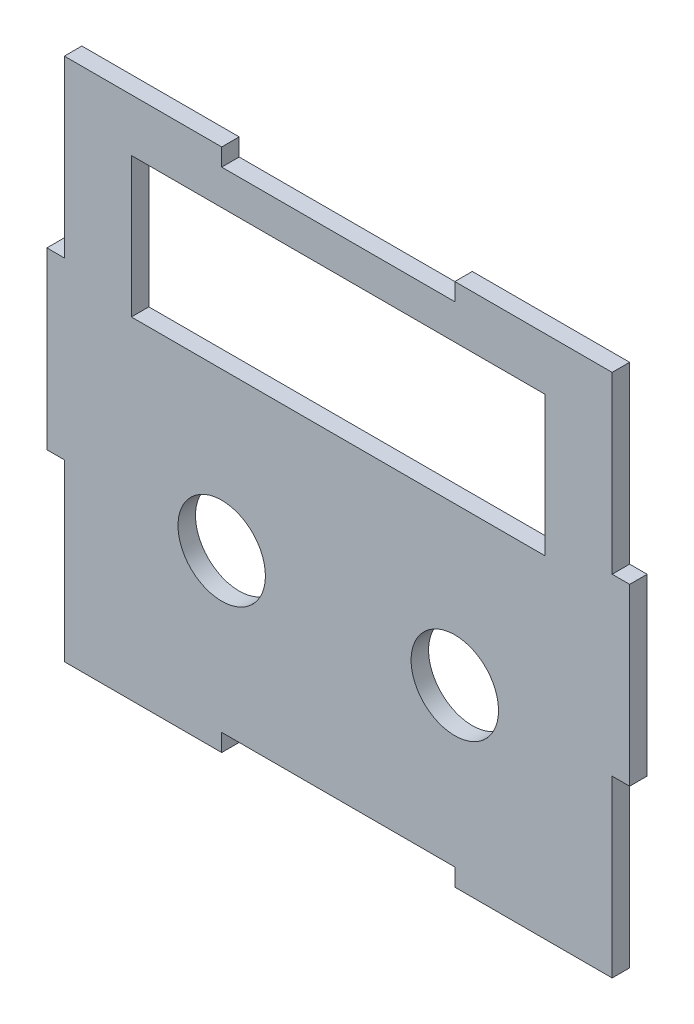
ISO-10303-21;
HEADER;
FILE_DESCRIPTION(('STEP AP214'),'2;1');
FILE_NAME('part.step','',(''),(''),'','','');
FILE_SCHEMA(('AUTOMOTIVE_DESIGN { 1 0 10303 214 1 1 1 1 }'));
ENDSEC;
DATA;
#1=APPLICATION_CONTEXT('core data for automotive mechanical design processes');
#2=APPLICATION_PROTOCOL_DEFINITION('international standard','automotive_design',2000,#1);
#3=PRODUCT_CONTEXT('',#1,'mechanical');
#4=PRODUCT('Part','Part','',(#3));
#5=PRODUCT_RELATED_PRODUCT_CATEGORY('part','',(#4));
#6=PRODUCT_DEFINITION_FORMATION('','',#4);
#7=PRODUCT_DEFINITION_CONTEXT('part definition',#1,'design');
#8=PRODUCT_DEFINITION('design','',#6,#7);
#9=PRODUCT_DEFINITION_SHAPE('','',#8);
#10=(LENGTH_UNIT() NAMED_UNIT(*) SI_UNIT(.MILLI.,.METRE.));
#11=(NAMED_UNIT(*) PLANE_ANGLE_UNIT() SI_UNIT($,.RADIAN.));
#12=(NAMED_UNIT(*) SI_UNIT($,.STERADIAN.) SOLID_ANGLE_UNIT());
#13=UNCERTAINTY_MEASURE_WITH_UNIT(LENGTH_MEASURE(1.E-05),#10,'distance_accuracy_value','');
#14=(GEOMETRIC_REPRESENTATION_CONTEXT(3) GLOBAL_UNCERTAINTY_ASSIGNED_CONTEXT((#13)) GLOBAL_UNIT_ASSIGNED_CONTEXT((#10,
#11,#12)) REPRESENTATION_CONTEXT('',''));
#15=CARTESIAN_POINT('',(0.,0.,0.));
#16=DIRECTION('',(0.,0.,1.));
#17=DIRECTION('',(1.,0.,0.));
#18=AXIS2_PLACEMENT_3D('',#15,#16,#17);
#19=CARTESIAN_POINT('',(-60.0385244305205,-64.3230403800475,3.));
#20=DIRECTION('',(0.,1.,0.));
#21=DIRECTION('',(0.,0.,1.));
#22=AXIS2_PLACEMENT_3D('',#19,#20,#21);
#23=PLANE('',#22);
#24=DIRECTION('',(1.,0.,0.));
#25=VECTOR('',#24,1.);
#26=CARTESIAN_POINT('',(-60.0385244305205,-64.3230403800475,0.));
#27=LINE('',#26,#25);
#28=CARTESIAN_POINT('',(-57.0385244305205,-64.3230403800475,0.));
#29=VERTEX_POINT('',#28);
#30=CARTESIAN_POINT('',(-30.0385244305205,-64.3230403800475,0.));
#31=VERTEX_POINT('',#30);
#32=EDGE_CURVE('E380',#29,#31,#27,.T.);
#33=ORIENTED_EDGE('',*,*,#32,.T.);
#34=DIRECTION('',(0.,0.,1.));
#35=VECTOR('',#34,1.);
#36=CARTESIAN_POINT('',(-30.0385244305205,-64.3230403800475,-0.00100000000000013));
#37=LINE('',#36,#35);
#38=CARTESIAN_POINT('',(-30.0385244305205,-64.3230403800475,3.));
#39=VERTEX_POINT('',#38);
#40=EDGE_CURVE('E254',#31,#39,#37,.T.);
#41=ORIENTED_EDGE('',*,*,#40,.T.);
#42=DIRECTION('',(1.,0.,0.));
#43=VECTOR('',#42,1.);
#44=CARTESIAN_POINT('',(-60.0385244305205,-64.3230403800475,3.));
#45=LINE('',#44,#43);
#46=CARTESIAN_POINT('',(-57.0385244305205,-64.3230403800475,3.));
#47=VERTEX_POINT('',#46);
#48=EDGE_CURVE('E371',#47,#39,#45,.T.);
#49=ORIENTED_EDGE('',*,*,#48,.F.);
#50=DIRECTION('',(0.,0.,1.));
#51=VECTOR('',#50,1.);
#52=CARTESIAN_POINT('',(-57.0385244305205,-64.3230403800475,-0.00100000000000013));
#53=LINE('',#52,#51);
#54=EDGE_CURVE('E273',#29,#47,#53,.T.);
#55=ORIENTED_EDGE('',*,*,#54,.F.);
#56=EDGE_LOOP('',(#33,#41,#49,#55));
#57=FACE_BOUND('',#56,.T.);
#58=ADVANCED_FACE('F33',(#57),#23,.F.);
#59=CARTESIAN_POINT('',(-60.0385244305205,25.6769596199525,3.));
#60=DIRECTION('',(0.,-1.,0.));
#61=DIRECTION('',(0.,0.,-1.));
#62=AXIS2_PLACEMENT_3D('',#59,#60,#61);
#63=PLANE('',#62);
#64=DIRECTION('',(-1.,0.,0.));
#65=VECTOR('',#64,1.);
#66=CARTESIAN_POINT('',(-60.0385244305205,25.6769596199525,0.));
#67=LINE('',#66,#65);
#68=CARTESIAN_POINT('',(-30.0385244305205,25.6769596199525,0.));
#69=VERTEX_POINT('',#68);
#70=CARTESIAN_POINT('',(-57.0385244305205,25.6769596199525,0.));
#71=VERTEX_POINT('',#70);
#72=EDGE_CURVE('E383',#69,#71,#67,.T.);
#73=ORIENTED_EDGE('',*,*,#72,.T.);
#74=DIRECTION('',(0.,0.,1.));
#75=VECTOR('',#74,1.);
#76=CARTESIAN_POINT('',(-57.0385244305205,25.6769596199525,-0.00100000000000013));
#77=LINE('',#76,#75);
#78=CARTESIAN_POINT('',(-57.0385244305205,25.6769596199525,3.));
#79=VERTEX_POINT('',#78);
#80=EDGE_CURVE('E289',#71,#79,#77,.T.);
#81=ORIENTED_EDGE('',*,*,#80,.T.);
#82=DIRECTION('',(-1.,0.,0.));
#83=VECTOR('',#82,1.);
#84=CARTESIAN_POINT('',(-60.0385244305205,25.6769596199525,3.));
#85=LINE('',#84,#83);
#86=CARTESIAN_POINT('',(-30.0385244305205,25.6769596199525,3.));
#87=VERTEX_POINT('',#86);
#88=EDGE_CURVE('E42',#87,#79,#85,.T.);
#89=ORIENTED_EDGE('',*,*,#88,.F.);
#90=DIRECTION('',(0.,0.,1.));
#91=VECTOR('',#90,1.);
#92=CARTESIAN_POINT('',(-30.0385244305205,25.6769596199525,-0.00100000000000013));
#93=LINE('',#92,#91);
#94=EDGE_CURVE('E312',#69,#87,#93,.T.);
#95=ORIENTED_EDGE('',*,*,#94,.F.);
#96=EDGE_LOOP('',(#73,#81,#89,#95));
#97=FACE_BOUND('',#96,.T.);
#98=ADVANCED_FACE('F455',(#97),#63,.F.);
#99=CARTESIAN_POINT('',(0.,0.,3.));
#100=DIRECTION('',(0.,0.,1.));
#101=DIRECTION('',(1.,0.,0.));
#102=AXIS2_PLACEMENT_3D('',#99,#100,#101);
#103=PLANE('',#102);
#104=DIRECTION('',(0.,-1.,0.));
#105=VECTOR('',#104,1.);
#106=CARTESIAN_POINT('',(36.9614755694795,25.6769596199525,3.));
#107=LINE('',#106,#105);
#108=CARTESIAN_POINT('',(36.9614755694795,25.6769596199525,3.));
#109=VERTEX_POINT('',#108);
#110=CARTESIAN_POINT('',(36.9614755694795,-4.32304038004751,3.));
#111=VERTEX_POINT('',#110);
#112=EDGE_CURVE('E197',#109,#111,#107,.T.);
#113=ORIENTED_EDGE('',*,*,#112,.F.);
#114=CARTESIAN_POINT('',(9.96147556947949,25.6769596199525,3.));
#115=VERTEX_POINT('',#114);
#116=EDGE_CURVE('E11',#109,#115,#85,.T.);
#117=ORIENTED_EDGE('',*,*,#116,.T.);
#118=DIRECTION('',(0.,1.,0.));
#119=VECTOR('',#118,1.);
#120=CARTESIAN_POINT('',(9.9614755694795,25.6769596199525,3.));
#121=LINE('',#120,#119);
#122=CARTESIAN_POINT('',(9.9614755694795,22.6769596199525,3.));
#123=VERTEX_POINT('',#122);
#124=EDGE_CURVE('E308',#123,#115,#121,.T.);
#125=ORIENTED_EDGE('',*,*,#124,.F.);
#126=DIRECTION('',(1.,0.,0.));
#127=VECTOR('',#126,1.);
#128=CARTESIAN_POINT('',(-30.0385244305205,22.6769596199525,3.));
#129=LINE('',#128,#127);
#130=CARTESIAN_POINT('',(-30.0385244305205,22.6769596199525,3.));
#131=VERTEX_POINT('',#130);
#132=EDGE_CURVE('E305',#131,#123,#129,.T.);
#133=ORIENTED_EDGE('',*,*,#132,.F.);
#134=DIRECTION('',(0.,-1.,0.));
#135=VECTOR('',#134,1.);
#136=CARTESIAN_POINT('',(-30.0385244305205,25.6769596199525,3.));
#137=LINE('',#136,#135);
#138=EDGE_CURVE('E302',#87,#131,#137,.T.);
#139=ORIENTED_EDGE('',*,*,#138,.F.);
#140=ORIENTED_EDGE('',*,*,#88,.T.);
#141=DIRECTION('',(0.,1.,0.));
#142=VECTOR('',#141,1.);
#143=CARTESIAN_POINT('',(-57.0385244305205,25.6769596199525,3.));
#144=LINE('',#143,#142);
#145=CARTESIAN_POINT('',(-57.0385244305205,-4.32304038004751,3.));
#146=VERTEX_POINT('',#145);
#147=EDGE_CURVE('E286',#146,#79,#144,.T.);
#148=ORIENTED_EDGE('',*,*,#147,.F.);
#149=DIRECTION('',(1.,0.,0.));
#150=VECTOR('',#149,1.);
#151=CARTESIAN_POINT('',(-60.0385244305205,-4.32304038004751,3.));
#152=LINE('',#151,#150);
#153=CARTESIAN_POINT('',(-60.0385244305205,-4.32304038004751,3.));
#154=VERTEX_POINT('',#153);
#155=EDGE_CURVE('E283',#154,#146,#152,.T.);
#156=ORIENTED_EDGE('',*,*,#155,.F.);
#157=DIRECTION('',(0.,-1.,0.));
#158=VECTOR('',#157,1.);
#159=CARTESIAN_POINT('',(-60.0385244305205,25.6769596199525,3.));
#160=LINE('',#159,#158);
#161=CARTESIAN_POINT('',(-60.0385244305205,-34.3230403800475,3.));
#162=VERTEX_POINT('',#161);
#163=EDGE_CURVE('E367',#154,#162,#160,.T.);
#164=ORIENTED_EDGE('',*,*,#163,.T.);
#165=DIRECTION('',(-1.,0.,0.));
#166=VECTOR('',#165,1.);
#167=CARTESIAN_POINT('',(-60.0385244305205,-34.3230403800475,3.));
#168=LINE('',#167,#166);
#169=CARTESIAN_POINT('',(-57.0385244305205,-34.3230403800475,3.));
#170=VERTEX_POINT('',#169);
#171=EDGE_CURVE('E271',#170,#162,#168,.T.);
#172=ORIENTED_EDGE('',*,*,#171,.F.);
#173=DIRECTION('',(0.,1.,0.));
#174=VECTOR('',#173,1.);
#175=CARTESIAN_POINT('',(-57.0385244305205,-34.3230403800475,3.));
#176=LINE('',#175,#174);
#177=EDGE_CURVE('E268',#47,#170,#176,.T.);
#178=ORIENTED_EDGE('',*,*,#177,.F.);
#179=ORIENTED_EDGE('',*,*,#48,.T.);
#180=DIRECTION('',(0.,-1.,0.));
#181=VECTOR('',#180,1.);
#182=CARTESIAN_POINT('',(-30.0385244305205,-64.3230403800475,3.));
#183=LINE('',#182,#181);
#184=CARTESIAN_POINT('',(-30.0385244305205,-61.3230403800475,3.));
#185=VERTEX_POINT('',#184);
#186=EDGE_CURVE('E246',#185,#39,#183,.T.);
#187=ORIENTED_EDGE('',*,*,#186,.F.);
#188=DIRECTION('',(-1.,0.,0.));
#189=VECTOR('',#188,1.);
#190=CARTESIAN_POINT('',(-30.0385244305205,-61.3230403800475,3.));
#191=LINE('',#190,#189);
#192=CARTESIAN_POINT('',(9.96147556947951,-61.3230403800475,3.));
#193=VERTEX_POINT('',#192);
#194=EDGE_CURVE('E251',#193,#185,#191,.T.);
#195=ORIENTED_EDGE('',*,*,#194,.F.);
#196=DIRECTION('',(0.,1.,0.));
#197=VECTOR('',#196,1.);
#198=CARTESIAN_POINT('',(9.9614755694795,-64.3230403800475,3.));
#199=LINE('',#198,#197);
#200=CARTESIAN_POINT('',(9.9614755694795,-64.3230403800475,3.));
#201=VERTEX_POINT('',#200);
#202=EDGE_CURVE('E248',#201,#193,#199,.T.);
#203=ORIENTED_EDGE('',*,*,#202,.F.);
#204=CARTESIAN_POINT('',(36.9614755694795,-64.3230403800475,3.));
#205=VERTEX_POINT('',#204);
#206=EDGE_CURVE('E370',#201,#205,#45,.T.);
#207=ORIENTED_EDGE('',*,*,#206,.T.);
#208=DIRECTION('',(0.,-1.,0.));
#209=VECTOR('',#208,1.);
#210=CARTESIAN_POINT('',(36.9614755694795,-64.3230403800475,3.));
#211=LINE('',#210,#209);
#212=CARTESIAN_POINT('',(36.9614755694795,-34.3230403800475,3.));
#213=VERTEX_POINT('',#212);
#214=EDGE_CURVE('E226',#213,#205,#211,.T.);
#215=ORIENTED_EDGE('',*,*,#214,.F.);
#216=DIRECTION('',(-1.,0.,0.));
#217=VECTOR('',#216,1.);
#218=CARTESIAN_POINT('',(36.9614755694795,-34.3230403800475,3.));
#219=LINE('',#218,#217);
#220=CARTESIAN_POINT('',(39.9614755694795,-34.3230403800475,3.));
#221=VERTEX_POINT('',#220);
#222=EDGE_CURVE('E228',#221,#213,#219,.T.);
#223=ORIENTED_EDGE('',*,*,#222,.F.);
#224=DIRECTION('',(0.,1.,0.));
#225=VECTOR('',#224,1.);
#226=CARTESIAN_POINT('',(39.9614755694795,25.6769596199525,3.));
#227=LINE('',#226,#225);
#228=CARTESIAN_POINT('',(39.9614755694795,-4.32304038004751,3.));
#229=VERTEX_POINT('',#228);
#230=EDGE_CURVE('E374',#221,#229,#227,.T.);
#231=ORIENTED_EDGE('',*,*,#230,.T.);
#232=DIRECTION('',(1.,0.,0.));
#233=VECTOR('',#232,1.);
#234=CARTESIAN_POINT('',(36.9614755694795,-4.32304038004751,3.));
#235=LINE('',#234,#233);
#236=EDGE_CURVE('E201',#111,#229,#235,.T.);
#237=ORIENTED_EDGE('',*,*,#236,.F.);
#238=EDGE_LOOP('',(#113,#117,#125,#133,#139,#140,#148,#156,#164,#172,#178,#179,#187,#195,#203,
#207,#215,#223,#231,#237));
#239=FACE_BOUND('',#238,.T.);
#240=CARTESIAN_POINT('',(-30.0385244305205,-34.3230403800475,3.));
#241=DIRECTION('',(0.,0.,1.));
#242=DIRECTION('',(1.,0.,0.));
#243=AXIS2_PLACEMENT_3D('',#240,#241,#242);
#244=CIRCLE('',#243,7.5);
#245=CARTESIAN_POINT('',(-22.5385244305205,-34.3230403800475,3.));
#246=VERTEX_POINT('',#245);
#247=EDGE_CURVE('E330',#246,#246,#244,.T.);
#248=ORIENTED_EDGE('',*,*,#247,.F.);
#249=EDGE_LOOP('',(#248));
#250=FACE_BOUND('',#249,.T.);
#251=DIRECTION('',(1.,0.,0.));
#252=VECTOR('',#251,1.);
#253=CARTESIAN_POINT('',(-45.5385244305205,-7.33966745843232,3.));
#254=LINE('',#253,#252);
#255=CARTESIAN_POINT('',(-45.5385244305205,-7.33966745843232,3.));
#256=VERTEX_POINT('',#255);
#257=CARTESIAN_POINT('',(25.4614755694795,-7.33966745843232,3.));
#258=VERTEX_POINT('',#257);
#259=EDGE_CURVE('E338',#256,#258,#254,.T.);
#260=ORIENTED_EDGE('',*,*,#259,.F.);
#261=DIRECTION('',(0.,-1.,0.));
#262=VECTOR('',#261,1.);
#263=CARTESIAN_POINT('',(-45.5385244305205,16.6603325415677,3.));
#264=LINE('',#263,#262);
#265=CARTESIAN_POINT('',(-45.5385244305205,16.6603325415677,3.));
#266=VERTEX_POINT('',#265);
#267=EDGE_CURVE('E336',#266,#256,#264,.T.);
#268=ORIENTED_EDGE('',*,*,#267,.F.);
#269=DIRECTION('',(-1.,0.,0.));
#270=VECTOR('',#269,1.);
#271=CARTESIAN_POINT('',(-45.5385244305205,16.6603325415677,3.));
#272=LINE('',#271,#270);
#273=CARTESIAN_POINT('',(25.4614755694795,16.6603325415677,3.));
#274=VERTEX_POINT('',#273);
#275=EDGE_CURVE('E344',#274,#266,#272,.T.);
#276=ORIENTED_EDGE('',*,*,#275,.F.);
#277=DIRECTION('',(0.,1.,0.));
#278=VECTOR('',#277,1.);
#279=CARTESIAN_POINT('',(25.4614755694795,16.6603325415677,3.));
#280=LINE('',#279,#278);
#281=EDGE_CURVE('E341',#258,#274,#280,.T.);
#282=ORIENTED_EDGE('',*,*,#281,.F.);
#283=EDGE_LOOP('',(#260,#268,#276,#282));
#284=FACE_BOUND('',#283,.T.);
#285=CARTESIAN_POINT('',(9.96147556947951,-34.3230403800475,3.));
#286=DIRECTION('',(0.,0.,1.));
#287=DIRECTION('',(1.,0.,0.));
#288=AXIS2_PLACEMENT_3D('',#285,#286,#287);
#289=CIRCLE('',#288,7.5);
#290=CARTESIAN_POINT('',(17.4614755694795,-34.3230403800475,3.));
#291=VERTEX_POINT('',#290);
#292=EDGE_CURVE('E324',#291,#291,#289,.T.);
#293=ORIENTED_EDGE('',*,*,#292,.F.);
#294=EDGE_LOOP('',(#293));
#295=FACE_BOUND('',#294,.T.);
#296=ADVANCED_FACE('F403',(#239,#250,#284,#295),#103,.T.);
#297=CARTESIAN_POINT('',(0.,0.,0.));
#298=DIRECTION('',(0.,0.,1.));
#299=DIRECTION('',(1.,0.,0.));
#300=AXIS2_PLACEMENT_3D('',#297,#298,#299);
#301=PLANE('',#300);
#302=CARTESIAN_POINT('',(36.9614755694795,25.6769596199525,0.));
#303=VERTEX_POINT('',#302);
#304=CARTESIAN_POINT('',(9.9614755694795,25.6769596199525,0.));
#305=VERTEX_POINT('',#304);
#306=EDGE_CURVE('E37',#303,#305,#67,.T.);
#307=ORIENTED_EDGE('',*,*,#306,.F.);
#308=DIRECTION('',(0.,1.,0.));
#309=VECTOR('',#308,1.);
#310=CARTESIAN_POINT('',(36.9614755694795,25.6769596199525,0.));
#311=LINE('',#310,#309);
#312=CARTESIAN_POINT('',(36.9614755694795,-4.32304038004751,0.));
#313=VERTEX_POINT('',#312);
#314=EDGE_CURVE('E50',#313,#303,#311,.T.);
#315=ORIENTED_EDGE('',*,*,#314,.F.);
#316=DIRECTION('',(-1.,0.,0.));
#317=VECTOR('',#316,1.);
#318=CARTESIAN_POINT('',(36.9614755694795,-4.32304038004751,0.));
#319=LINE('',#318,#317);
#320=CARTESIAN_POINT('',(39.9614755694795,-4.32304038004751,0.));
#321=VERTEX_POINT('',#320);
#322=EDGE_CURVE('E204',#321,#313,#319,.T.);
#323=ORIENTED_EDGE('',*,*,#322,.F.);
#324=DIRECTION('',(0.,1.,0.));
#325=VECTOR('',#324,1.);
#326=CARTESIAN_POINT('',(39.9614755694795,25.6769596199525,0.));
#327=LINE('',#326,#325);
#328=CARTESIAN_POINT('',(39.9614755694795,-34.3230403800475,0.));
#329=VERTEX_POINT('',#328);
#330=EDGE_CURVE('E382',#329,#321,#327,.T.);
#331=ORIENTED_EDGE('',*,*,#330,.F.);
#332=DIRECTION('',(1.,0.,0.));
#333=VECTOR('',#332,1.);
#334=CARTESIAN_POINT('',(36.9614755694795,-34.3230403800475,0.));
#335=LINE('',#334,#333);
#336=CARTESIAN_POINT('',(36.9614755694795,-34.3230403800475,0.));
#337=VERTEX_POINT('',#336);
#338=EDGE_CURVE('E58',#337,#329,#335,.T.);
#339=ORIENTED_EDGE('',*,*,#338,.F.);
#340=DIRECTION('',(0.,1.,0.));
#341=VECTOR('',#340,1.);
#342=CARTESIAN_POINT('',(36.9614755694795,-64.3230403800475,0.));
#343=LINE('',#342,#341);
#344=CARTESIAN_POINT('',(36.9614755694795,-64.3230403800475,0.));
#345=VERTEX_POINT('',#344);
#346=EDGE_CURVE('E223',#345,#337,#343,.T.);
#347=ORIENTED_EDGE('',*,*,#346,.F.);
#348=CARTESIAN_POINT('',(9.96147556947948,-64.3230403800475,0.));
#349=VERTEX_POINT('',#348);
#350=EDGE_CURVE('E379',#349,#345,#27,.T.);
#351=ORIENTED_EDGE('',*,*,#350,.F.);
#352=DIRECTION('',(0.,-1.,0.));
#353=VECTOR('',#352,1.);
#354=CARTESIAN_POINT('',(9.9614755694795,-64.3230403800475,0.));
#355=LINE('',#354,#353);
#356=CARTESIAN_POINT('',(9.96147556947951,-61.3230403800475,0.));
#357=VERTEX_POINT('',#356);
#358=EDGE_CURVE('E234',#357,#349,#355,.T.);
#359=ORIENTED_EDGE('',*,*,#358,.F.);
#360=DIRECTION('',(1.,0.,0.));
#361=VECTOR('',#360,1.);
#362=CARTESIAN_POINT('',(-30.0385244305205,-61.3230403800475,0.));
#363=LINE('',#362,#361);
#364=CARTESIAN_POINT('',(-30.0385244305205,-61.3230403800475,0.));
#365=VERTEX_POINT('',#364);
#366=EDGE_CURVE('E240',#365,#357,#363,.T.);
#367=ORIENTED_EDGE('',*,*,#366,.F.);
#368=DIRECTION('',(0.,1.,0.));
#369=VECTOR('',#368,1.);
#370=CARTESIAN_POINT('',(-30.0385244305205,-64.3230403800475,0.));
#371=LINE('',#370,#369);
#372=EDGE_CURVE('E243',#31,#365,#371,.T.);
#373=ORIENTED_EDGE('',*,*,#372,.F.);
#374=ORIENTED_EDGE('',*,*,#32,.F.);
#375=DIRECTION('',(0.,-1.,0.));
#376=VECTOR('',#375,1.);
#377=CARTESIAN_POINT('',(-57.0385244305205,-34.3230403800475,0.));
#378=LINE('',#377,#376);
#379=CARTESIAN_POINT('',(-57.0385244305205,-34.3230403800475,0.));
#380=VERTEX_POINT('',#379);
#381=EDGE_CURVE('E257',#380,#29,#378,.T.);
#382=ORIENTED_EDGE('',*,*,#381,.F.);
#383=DIRECTION('',(1.,0.,0.));
#384=VECTOR('',#383,1.);
#385=CARTESIAN_POINT('',(-60.0385244305205,-34.3230403800475,0.));
#386=LINE('',#385,#384);
#387=CARTESIAN_POINT('',(-60.0385244305205,-34.3230403800475,0.));
#388=VERTEX_POINT('',#387);
#389=EDGE_CURVE('E265',#388,#380,#386,.T.);
#390=ORIENTED_EDGE('',*,*,#389,.F.);
#391=DIRECTION('',(0.,-1.,0.));
#392=VECTOR('',#391,1.);
#393=CARTESIAN_POINT('',(-60.0385244305205,25.6769596199525,0.));
#394=LINE('',#393,#392);
#395=CARTESIAN_POINT('',(-60.0385244305205,-4.3230403800475,0.));
#396=VERTEX_POINT('',#395);
#397=EDGE_CURVE('E366',#396,#388,#394,.T.);
#398=ORIENTED_EDGE('',*,*,#397,.F.);
#399=DIRECTION('',(-1.,0.,0.));
#400=VECTOR('',#399,1.);
#401=CARTESIAN_POINT('',(-60.0385244305205,-4.32304038004751,0.));
#402=LINE('',#401,#400);
#403=CARTESIAN_POINT('',(-57.0385244305205,-4.32304038004751,0.));
#404=VERTEX_POINT('',#403);
#405=EDGE_CURVE('E292',#404,#396,#402,.T.);
#406=ORIENTED_EDGE('',*,*,#405,.F.);
#407=DIRECTION('',(0.,-1.,0.));
#408=VECTOR('',#407,1.);
#409=CARTESIAN_POINT('',(-57.0385244305205,25.6769596199525,0.));
#410=LINE('',#409,#408);
#411=EDGE_CURVE('E277',#71,#404,#410,.T.);
#412=ORIENTED_EDGE('',*,*,#411,.F.);
#413=ORIENTED_EDGE('',*,*,#72,.F.);
#414=DIRECTION('',(0.,1.,0.));
#415=VECTOR('',#414,1.);
#416=CARTESIAN_POINT('',(-30.0385244305205,25.6769596199525,0.));
#417=LINE('',#416,#415);
#418=CARTESIAN_POINT('',(-30.0385244305205,22.6769596199525,0.));
#419=VERTEX_POINT('',#418);
#420=EDGE_CURVE('E300',#419,#69,#417,.T.);
#421=ORIENTED_EDGE('',*,*,#420,.F.);
#422=DIRECTION('',(-1.,0.,0.));
#423=VECTOR('',#422,1.);
#424=CARTESIAN_POINT('',(-30.0385244305205,22.6769596199525,0.));
#425=LINE('',#424,#423);
#426=CARTESIAN_POINT('',(9.9614755694795,22.6769596199525,0.));
#427=VERTEX_POINT('',#426);
#428=EDGE_CURVE('E314',#427,#419,#425,.T.);
#429=ORIENTED_EDGE('',*,*,#428,.F.);
#430=DIRECTION('',(0.,-1.,0.));
#431=VECTOR('',#430,1.);
#432=CARTESIAN_POINT('',(9.9614755694795,25.6769596199525,0.));
#433=LINE('',#432,#431);
#434=EDGE_CURVE('E297',#305,#427,#433,.T.);
#435=ORIENTED_EDGE('',*,*,#434,.F.);
#436=EDGE_LOOP('',(#307,#315,#323,#331,#339,#347,#351,#359,#367,#373,#374,#382,#390,#398,#406,
#412,#413,#421,#429,#435));
#437=FACE_BOUND('',#436,.T.);
#438=CARTESIAN_POINT('',(-30.0385244305205,-34.3230403800475,0.));
#439=DIRECTION('',(0.,0.,1.));
#440=DIRECTION('',(1.,0.,0.));
#441=AXIS2_PLACEMENT_3D('',#438,#439,#440);
#442=CIRCLE('',#441,7.5);
#443=CARTESIAN_POINT('',(-22.5385244305205,-34.3230403800475,0.));
#444=VERTEX_POINT('',#443);
#445=EDGE_CURVE('E327',#444,#444,#442,.T.);
#446=ORIENTED_EDGE('',*,*,#445,.T.);
#447=EDGE_LOOP('',(#446));
#448=FACE_BOUND('',#447,.T.);
#449=DIRECTION('',(0.,-1.,0.));
#450=VECTOR('',#449,1.);
#451=CARTESIAN_POINT('',(-45.5385244305205,16.6603325415677,0.));
#452=LINE('',#451,#450);
#453=CARTESIAN_POINT('',(-45.5385244305205,16.6603325415677,0.));
#454=VERTEX_POINT('',#453);
#455=CARTESIAN_POINT('',(-45.5385244305205,-7.33966745843232,0.));
#456=VERTEX_POINT('',#455);
#457=EDGE_CURVE('E333',#454,#456,#452,.T.);
#458=ORIENTED_EDGE('',*,*,#457,.T.);
#459=DIRECTION('',(1.,0.,0.));
#460=VECTOR('',#459,1.);
#461=CARTESIAN_POINT('',(-45.5385244305205,-7.33966745843232,0.));
#462=LINE('',#461,#460);
#463=CARTESIAN_POINT('',(25.4614755694795,-7.33966745843232,0.));
#464=VERTEX_POINT('',#463);
#465=EDGE_CURVE('E349',#456,#464,#462,.T.);
#466=ORIENTED_EDGE('',*,*,#465,.T.);
#467=DIRECTION('',(0.,1.,0.));
#468=VECTOR('',#467,1.);
#469=CARTESIAN_POINT('',(25.4614755694795,16.6603325415677,0.));
#470=LINE('',#469,#468);
#471=CARTESIAN_POINT('',(25.4614755694795,16.6603325415677,0.));
#472=VERTEX_POINT('',#471);
#473=EDGE_CURVE('E352',#464,#472,#470,.T.);
#474=ORIENTED_EDGE('',*,*,#473,.T.);
#475=DIRECTION('',(-1.,0.,0.));
#476=VECTOR('',#475,1.);
#477=CARTESIAN_POINT('',(-45.5385244305205,16.6603325415677,0.));
#478=LINE('',#477,#476);
#479=EDGE_CURVE('E339',#472,#454,#478,.T.);
#480=ORIENTED_EDGE('',*,*,#479,.T.);
#481=EDGE_LOOP('',(#458,#466,#474,#480));
#482=FACE_BOUND('',#481,.T.);
#483=CARTESIAN_POINT('',(9.96147556947951,-34.3230403800475,0.));
#484=DIRECTION('',(0.,0.,1.));
#485=DIRECTION('',(1.,0.,0.));
#486=AXIS2_PLACEMENT_3D('',#483,#484,#485);
#487=CIRCLE('',#486,7.5);
#488=CARTESIAN_POINT('',(17.4614755694795,-34.3230403800475,0.));
#489=VERTEX_POINT('',#488);
#490=EDGE_CURVE('E323',#489,#489,#487,.T.);
#491=ORIENTED_EDGE('',*,*,#490,.T.);
#492=EDGE_LOOP('',(#491));
#493=FACE_BOUND('',#492,.T.);
#494=ADVANCED_FACE('F213',(#437,#448,#482,#493),#301,.F.);
#495=CARTESIAN_POINT('',(-60.0385244305205,25.6769596199525,3.));
#496=DIRECTION('',(1.,0.,0.));
#497=DIRECTION('',(0.,1.,0.));
#498=AXIS2_PLACEMENT_3D('',#495,#496,#497);
#499=PLANE('',#498);
#500=ORIENTED_EDGE('',*,*,#397,.T.);
#501=DIRECTION('',(0.,0.,1.));
#502=VECTOR('',#501,1.);
#503=CARTESIAN_POINT('',(-60.0385244305205,-34.3230403800475,-0.00100000000000013));
#504=LINE('',#503,#502);
#505=EDGE_CURVE('E274',#388,#162,#504,.T.);
#506=ORIENTED_EDGE('',*,*,#505,.T.);
#507=ORIENTED_EDGE('',*,*,#163,.F.);
#508=DIRECTION('',(0.,0.,1.));
#509=VECTOR('',#508,1.);
#510=CARTESIAN_POINT('',(-60.0385244305205,-4.32304038004751,-0.00100000000000013));
#511=LINE('',#510,#509);
#512=EDGE_CURVE('E288',#396,#154,#511,.T.);
#513=ORIENTED_EDGE('',*,*,#512,.F.);
#514=EDGE_LOOP('',(#500,#506,#507,#513));
#515=FACE_BOUND('',#514,.T.);
#516=ADVANCED_FACE('F35',(#515),#499,.F.);
#517=ORIENTED_EDGE('',*,*,#350,.T.);
#518=DIRECTION('',(0.,0.,1.));
#519=VECTOR('',#518,1.);
#520=CARTESIAN_POINT('',(36.9614755694795,-64.3230403800475,-0.00100000000000013));
#521=LINE('',#520,#519);
#522=EDGE_CURVE('E231',#345,#205,#521,.T.);
#523=ORIENTED_EDGE('',*,*,#522,.T.);
#524=ORIENTED_EDGE('',*,*,#206,.F.);
#525=DIRECTION('',(0.,0.,1.));
#526=VECTOR('',#525,1.);
#527=CARTESIAN_POINT('',(9.9614755694795,-64.3230403800475,-0.00100000000000013));
#528=LINE('',#527,#526);
#529=EDGE_CURVE('E260',#349,#201,#528,.T.);
#530=ORIENTED_EDGE('',*,*,#529,.F.);
#531=EDGE_LOOP('',(#517,#523,#524,#530));
#532=FACE_BOUND('',#531,.T.);
#533=ADVANCED_FACE('F415',(#532),#23,.F.);
#534=CARTESIAN_POINT('',(39.9614755694795,25.6769596199525,3.));
#535=DIRECTION('',(-1.,0.,0.));
#536=DIRECTION('',(0.,-1.,0.));
#537=AXIS2_PLACEMENT_3D('',#534,#535,#536);
#538=PLANE('',#537);
#539=ORIENTED_EDGE('',*,*,#330,.T.);
#540=DIRECTION('',(0.,0.,1.));
#541=VECTOR('',#540,1.);
#542=CARTESIAN_POINT('',(39.9614755694795,-4.32304038004751,-0.00100000000000013));
#543=LINE('',#542,#541);
#544=EDGE_CURVE('E200',#321,#229,#543,.T.);
#545=ORIENTED_EDGE('',*,*,#544,.T.);
#546=ORIENTED_EDGE('',*,*,#230,.F.);
#547=DIRECTION('',(0.,0.,1.));
#548=VECTOR('',#547,1.);
#549=CARTESIAN_POINT('',(39.9614755694795,-34.3230403800475,-0.00100000000000013));
#550=LINE('',#549,#548);
#551=EDGE_CURVE('E235',#329,#221,#550,.T.);
#552=ORIENTED_EDGE('',*,*,#551,.F.);
#553=EDGE_LOOP('',(#539,#545,#546,#552));
#554=FACE_BOUND('',#553,.T.);
#555=ADVANCED_FACE('F407',(#554),#538,.F.);
#556=ORIENTED_EDGE('',*,*,#116,.F.);
#557=DIRECTION('',(0.,0.,1.));
#558=VECTOR('',#557,1.);
#559=CARTESIAN_POINT('',(36.9614755694795,25.6769596199525,-0.00100000000000013));
#560=LINE('',#559,#558);
#561=EDGE_CURVE('E210',#303,#109,#560,.T.);
#562=ORIENTED_EDGE('',*,*,#561,.F.);
#563=ORIENTED_EDGE('',*,*,#306,.T.);
#564=DIRECTION('',(0.,0.,1.));
#565=VECTOR('',#564,1.);
#566=CARTESIAN_POINT('',(9.9614755694795,25.6769596199525,-0.00100000000000013));
#567=LINE('',#566,#565);
#568=EDGE_CURVE('E315',#305,#115,#567,.T.);
#569=ORIENTED_EDGE('',*,*,#568,.T.);
#570=EDGE_LOOP('',(#556,#562,#563,#569));
#571=FACE_BOUND('',#570,.T.);
#572=ADVANCED_FACE('F392',(#571),#63,.F.);
#573=CARTESIAN_POINT('',(-45.5385244305205,16.6603325415677,3.));
#574=DIRECTION('',(1.,0.,0.));
#575=DIRECTION('',(0.,0.,-1.));
#576=AXIS2_PLACEMENT_3D('',#573,#574,#575);
#577=PLANE('',#576);
#578=ORIENTED_EDGE('',*,*,#457,.F.);
#579=DIRECTION('',(0.,0.,-1.));
#580=VECTOR('',#579,1.);
#581=CARTESIAN_POINT('',(-45.5385244305205,16.6603325415677,3.));
#582=LINE('',#581,#580);
#583=EDGE_CURVE('E346',#266,#454,#582,.T.);
#584=ORIENTED_EDGE('',*,*,#583,.F.);
#585=ORIENTED_EDGE('',*,*,#267,.T.);
#586=DIRECTION('',(0.,0.,-1.));
#587=VECTOR('',#586,1.);
#588=CARTESIAN_POINT('',(-45.5385244305205,-7.33966745843232,3.));
#589=LINE('',#588,#587);
#590=EDGE_CURVE('E363',#256,#456,#589,.T.);
#591=ORIENTED_EDGE('',*,*,#590,.T.);
#592=EDGE_LOOP('',(#578,#584,#585,#591));
#593=FACE_BOUND('',#592,.T.);
#594=ADVANCED_FACE('F491',(#593),#577,.T.);
#595=CARTESIAN_POINT('',(-45.5385244305205,-7.33966745843232,3.));
#596=DIRECTION('',(0.,1.,0.));
#597=DIRECTION('',(-1.,0.,0.));
#598=AXIS2_PLACEMENT_3D('',#595,#596,#597);
#599=PLANE('',#598);
#600=ORIENTED_EDGE('',*,*,#465,.F.);
#601=ORIENTED_EDGE('',*,*,#590,.F.);
#602=ORIENTED_EDGE('',*,*,#259,.T.);
#603=DIRECTION('',(0.,0.,-1.));
#604=VECTOR('',#603,1.);
#605=CARTESIAN_POINT('',(25.4614755694795,-7.33966745843232,3.));
#606=LINE('',#605,#604);
#607=EDGE_CURVE('E361',#258,#464,#606,.T.);
#608=ORIENTED_EDGE('',*,*,#607,.T.);
#609=EDGE_LOOP('',(#600,#601,#602,#608));
#610=FACE_BOUND('',#609,.T.);
#611=ADVANCED_FACE('F495',(#610),#599,.T.);
#612=CARTESIAN_POINT('',(25.4614755694795,16.6603325415677,3.));
#613=DIRECTION('',(-1.,0.,0.));
#614=DIRECTION('',(0.,-1.,0.));
#615=AXIS2_PLACEMENT_3D('',#612,#613,#614);
#616=PLANE('',#615);
#617=ORIENTED_EDGE('',*,*,#473,.F.);
#618=ORIENTED_EDGE('',*,*,#607,.F.);
#619=ORIENTED_EDGE('',*,*,#281,.T.);
#620=DIRECTION('',(0.,0.,-1.));
#621=VECTOR('',#620,1.);
#622=CARTESIAN_POINT('',(25.4614755694795,16.6603325415677,3.));
#623=LINE('',#622,#621);
#624=EDGE_CURVE('E359',#274,#472,#623,.T.);
#625=ORIENTED_EDGE('',*,*,#624,.T.);
#626=EDGE_LOOP('',(#617,#618,#619,#625));
#627=FACE_BOUND('',#626,.T.);
#628=ADVANCED_FACE('F500',(#627),#616,.T.);
#629=CARTESIAN_POINT('',(-45.5385244305205,16.6603325415677,3.));
#630=DIRECTION('',(0.,-1.,0.));
#631=DIRECTION('',(0.,0.,-1.));
#632=AXIS2_PLACEMENT_3D('',#629,#630,#631);
#633=PLANE('',#632);
#634=ORIENTED_EDGE('',*,*,#479,.F.);
#635=ORIENTED_EDGE('',*,*,#624,.F.);
#636=ORIENTED_EDGE('',*,*,#275,.T.);
#637=ORIENTED_EDGE('',*,*,#583,.T.);
#638=EDGE_LOOP('',(#634,#635,#636,#637));
#639=FACE_BOUND('',#638,.T.);
#640=ADVANCED_FACE('F506',(#639),#633,.T.);
#641=CARTESIAN_POINT('',(-30.0385244305205,-34.3230403800475,3.));
#642=DIRECTION('',(0.,0.,-1.));
#643=DIRECTION('',(-1.,0.,0.));
#644=AXIS2_PLACEMENT_3D('',#641,#642,#643);
#645=CYLINDRICAL_SURFACE('',#644,7.5);
#646=ORIENTED_EDGE('',*,*,#247,.T.);
#647=EDGE_LOOP('',(#646));
#648=FACE_BOUND('',#647,.T.);
#649=ORIENTED_EDGE('',*,*,#445,.F.);
#650=EDGE_LOOP('',(#649));
#651=FACE_BOUND('',#650,.T.);
#652=ADVANCED_FACE('F466',(#648,#651),#645,.F.);
#653=CARTESIAN_POINT('',(9.96147556947951,-34.3230403800475,3.));
#654=DIRECTION('',(0.,0.,-1.));
#655=DIRECTION('',(-1.,0.,0.));
#656=AXIS2_PLACEMENT_3D('',#653,#654,#655);
#657=CYLINDRICAL_SURFACE('',#656,7.5);
#658=ORIENTED_EDGE('',*,*,#292,.T.);
#659=EDGE_LOOP('',(#658));
#660=FACE_BOUND('',#659,.T.);
#661=ORIENTED_EDGE('',*,*,#490,.F.);
#662=EDGE_LOOP('',(#661));
#663=FACE_BOUND('',#662,.T.);
#664=ADVANCED_FACE('F459',(#660,#663),#657,.F.);
#665=CARTESIAN_POINT('',(-30.0385244305205,25.6769596199525,-0.00100000000000013));
#666=DIRECTION('',(-1.,0.,0.));
#667=DIRECTION('',(0.,0.,1.));
#668=AXIS2_PLACEMENT_3D('',#665,#666,#667);
#669=PLANE('',#668);
#670=ORIENTED_EDGE('',*,*,#420,.T.);
#671=ORIENTED_EDGE('',*,*,#94,.T.);
#672=ORIENTED_EDGE('',*,*,#138,.T.);
#673=DIRECTION('',(0.,0.,1.));
#674=VECTOR('',#673,1.);
#675=CARTESIAN_POINT('',(-30.0385244305205,22.6769596199525,-0.00100000000000013));
#676=LINE('',#675,#674);
#677=EDGE_CURVE('E311',#419,#131,#676,.T.);
#678=ORIENTED_EDGE('',*,*,#677,.F.);
#679=EDGE_LOOP('',(#670,#671,#672,#678));
#680=FACE_BOUND('',#679,.T.);
#681=ADVANCED_FACE('F457',(#680),#669,.F.);
#682=CARTESIAN_POINT('',(9.9614755694795,25.6769596199525,-0.00100000000000013));
#683=DIRECTION('',(1.,0.,0.));
#684=DIRECTION('',(0.,0.,-1.));
#685=AXIS2_PLACEMENT_3D('',#682,#683,#684);
#686=PLANE('',#685);
#687=ORIENTED_EDGE('',*,*,#434,.T.);
#688=DIRECTION('',(0.,0.,1.));
#689=VECTOR('',#688,1.);
#690=CARTESIAN_POINT('',(9.9614755694795,22.6769596199525,-0.00100000000000013));
#691=LINE('',#690,#689);
#692=EDGE_CURVE('E318',#427,#123,#691,.T.);
#693=ORIENTED_EDGE('',*,*,#692,.T.);
#694=ORIENTED_EDGE('',*,*,#124,.T.);
#695=ORIENTED_EDGE('',*,*,#568,.F.);
#696=EDGE_LOOP('',(#687,#693,#694,#695));
#697=FACE_BOUND('',#696,.T.);
#698=ADVANCED_FACE('F394',(#697),#686,.F.);
#699=CARTESIAN_POINT('',(-30.0385244305205,22.6769596199525,-0.00100000000000013));
#700=DIRECTION('',(0.,-1.,0.));
#701=DIRECTION('',(0.,0.,-1.));
#702=AXIS2_PLACEMENT_3D('',#699,#700,#701);
#703=PLANE('',#702);
#704=ORIENTED_EDGE('',*,*,#428,.T.);
#705=ORIENTED_EDGE('',*,*,#677,.T.);
#706=ORIENTED_EDGE('',*,*,#132,.T.);
#707=ORIENTED_EDGE('',*,*,#692,.F.);
#708=EDGE_LOOP('',(#704,#705,#706,#707));
#709=FACE_BOUND('',#708,.T.);
#710=ADVANCED_FACE('F399',(#709),#703,.F.);
#711=CARTESIAN_POINT('',(-57.0385244305205,25.6769596199525,-0.00100000000000013));
#712=DIRECTION('',(1.,0.,0.));
#713=DIRECTION('',(0.,1.,0.));
#714=AXIS2_PLACEMENT_3D('',#711,#712,#713);
#715=PLANE('',#714);
#716=ORIENTED_EDGE('',*,*,#411,.T.);
#717=DIRECTION('',(0.,0.,1.));
#718=VECTOR('',#717,1.);
#719=CARTESIAN_POINT('',(-57.0385244305205,-4.32304038004751,-0.00100000000000013));
#720=LINE('',#719,#718);
#721=EDGE_CURVE('E293',#404,#146,#720,.T.);
#722=ORIENTED_EDGE('',*,*,#721,.T.);
#723=ORIENTED_EDGE('',*,*,#147,.T.);
#724=ORIENTED_EDGE('',*,*,#80,.F.);
#725=EDGE_LOOP('',(#716,#722,#723,#724));
#726=FACE_BOUND('',#725,.T.);
#727=ADVANCED_FACE('F452',(#726),#715,.F.);
#728=CARTESIAN_POINT('',(-60.0385244305205,-4.32304038004751,-0.00100000000000013));
#729=DIRECTION('',(0.,-1.,0.));
#730=DIRECTION('',(0.,0.,-1.));
#731=AXIS2_PLACEMENT_3D('',#728,#729,#730);
#732=PLANE('',#731);
#733=ORIENTED_EDGE('',*,*,#405,.T.);
#734=ORIENTED_EDGE('',*,*,#512,.T.);
#735=ORIENTED_EDGE('',*,*,#155,.T.);
#736=ORIENTED_EDGE('',*,*,#721,.F.);
#737=EDGE_LOOP('',(#733,#734,#735,#736));
#738=FACE_BOUND('',#737,.T.);
#739=ADVANCED_FACE('F449',(#738),#732,.F.);
#740=CARTESIAN_POINT('',(-60.0385244305205,-34.3230403800475,-0.00100000000000013));
#741=DIRECTION('',(0.,1.,0.));
#742=DIRECTION('',(0.,0.,1.));
#743=AXIS2_PLACEMENT_3D('',#740,#741,#742);
#744=PLANE('',#743);
#745=ORIENTED_EDGE('',*,*,#389,.T.);
#746=DIRECTION('',(0.,0.,1.));
#747=VECTOR('',#746,1.);
#748=CARTESIAN_POINT('',(-57.0385244305205,-34.3230403800475,-0.00100000000000013));
#749=LINE('',#748,#747);
#750=EDGE_CURVE('E278',#380,#170,#749,.T.);
#751=ORIENTED_EDGE('',*,*,#750,.T.);
#752=ORIENTED_EDGE('',*,*,#171,.T.);
#753=ORIENTED_EDGE('',*,*,#505,.F.);
#754=EDGE_LOOP('',(#745,#751,#752,#753));
#755=FACE_BOUND('',#754,.T.);
#756=ADVANCED_FACE('F441',(#755),#744,.F.);
#757=CARTESIAN_POINT('',(-57.0385244305205,-34.3230403800475,-0.00100000000000013));
#758=DIRECTION('',(1.,0.,0.));
#759=DIRECTION('',(0.,0.,-1.));
#760=AXIS2_PLACEMENT_3D('',#757,#758,#759);
#761=PLANE('',#760);
#762=ORIENTED_EDGE('',*,*,#381,.T.);
#763=ORIENTED_EDGE('',*,*,#54,.T.);
#764=ORIENTED_EDGE('',*,*,#177,.T.);
#765=ORIENTED_EDGE('',*,*,#750,.F.);
#766=EDGE_LOOP('',(#762,#763,#764,#765));
#767=FACE_BOUND('',#766,.T.);
#768=ADVANCED_FACE('F436',(#767),#761,.F.);
#769=CARTESIAN_POINT('',(-30.0385244305205,-64.3230403800475,-0.00100000000000013));
#770=DIRECTION('',(-1.,0.,0.));
#771=DIRECTION('',(0.,0.,1.));
#772=AXIS2_PLACEMENT_3D('',#769,#770,#771);
#773=PLANE('',#772);
#774=ORIENTED_EDGE('',*,*,#372,.T.);
#775=DIRECTION('',(0.,0.,1.));
#776=VECTOR('',#775,1.);
#777=CARTESIAN_POINT('',(-30.0385244305205,-61.3230403800475,-0.00100000000000013));
#778=LINE('',#777,#776);
#779=EDGE_CURVE('E255',#365,#185,#778,.T.);
#780=ORIENTED_EDGE('',*,*,#779,.T.);
#781=ORIENTED_EDGE('',*,*,#186,.T.);
#782=ORIENTED_EDGE('',*,*,#40,.F.);
#783=EDGE_LOOP('',(#774,#780,#781,#782));
#784=FACE_BOUND('',#783,.T.);
#785=ADVANCED_FACE('F629',(#784),#773,.F.);
#786=CARTESIAN_POINT('',(-30.0385244305205,-61.3230403800475,-0.00100000000000013));
#787=DIRECTION('',(0.,1.,0.));
#788=DIRECTION('',(0.,0.,1.));
#789=AXIS2_PLACEMENT_3D('',#786,#787,#788);
#790=PLANE('',#789);
#791=ORIENTED_EDGE('',*,*,#366,.T.);
#792=DIRECTION('',(0.,0.,1.));
#793=VECTOR('',#792,1.);
#794=CARTESIAN_POINT('',(9.96147556947951,-61.3230403800475,-0.00100000000000013));
#795=LINE('',#794,#793);
#796=EDGE_CURVE('E258',#357,#193,#795,.T.);
#797=ORIENTED_EDGE('',*,*,#796,.T.);
#798=ORIENTED_EDGE('',*,*,#194,.T.);
#799=ORIENTED_EDGE('',*,*,#779,.F.);
#800=EDGE_LOOP('',(#791,#797,#798,#799));
#801=FACE_BOUND('',#800,.T.);
#802=ADVANCED_FACE('F425',(#801),#790,.F.);
#803=CARTESIAN_POINT('',(9.9614755694795,-64.3230403800475,-0.00100000000000013));
#804=DIRECTION('',(1.,0.,0.));
#805=DIRECTION('',(0.,1.,0.));
#806=AXIS2_PLACEMENT_3D('',#803,#804,#805);
#807=PLANE('',#806);
#808=ORIENTED_EDGE('',*,*,#358,.T.);
#809=ORIENTED_EDGE('',*,*,#529,.T.);
#810=ORIENTED_EDGE('',*,*,#202,.T.);
#811=ORIENTED_EDGE('',*,*,#796,.F.);
#812=EDGE_LOOP('',(#808,#809,#810,#811));
#813=FACE_BOUND('',#812,.T.);
#814=ADVANCED_FACE('F420',(#813),#807,.F.);
#815=CARTESIAN_POINT('',(36.9614755694795,-64.3230403800475,-0.00100000000000013));
#816=DIRECTION('',(-1.,0.,0.));
#817=DIRECTION('',(0.,-1.,0.));
#818=AXIS2_PLACEMENT_3D('',#815,#816,#817);
#819=PLANE('',#818);
#820=ORIENTED_EDGE('',*,*,#346,.T.);
#821=DIRECTION('',(0.,0.,1.));
#822=VECTOR('',#821,1.);
#823=CARTESIAN_POINT('',(36.9614755694795,-34.3230403800475,-0.00100000000000013));
#824=LINE('',#823,#822);
#825=EDGE_CURVE('E232',#337,#213,#824,.T.);
#826=ORIENTED_EDGE('',*,*,#825,.T.);
#827=ORIENTED_EDGE('',*,*,#214,.T.);
#828=ORIENTED_EDGE('',*,*,#522,.F.);
#829=EDGE_LOOP('',(#820,#826,#827,#828));
#830=FACE_BOUND('',#829,.T.);
#831=ADVANCED_FACE('F654',(#830),#819,.F.);
#832=CARTESIAN_POINT('',(36.9614755694795,-34.3230403800475,-0.00100000000000013));
#833=DIRECTION('',(0.,1.,0.));
#834=DIRECTION('',(0.,0.,1.));
#835=AXIS2_PLACEMENT_3D('',#832,#833,#834);
#836=PLANE('',#835);
#837=ORIENTED_EDGE('',*,*,#338,.T.);
#838=ORIENTED_EDGE('',*,*,#551,.T.);
#839=ORIENTED_EDGE('',*,*,#222,.T.);
#840=ORIENTED_EDGE('',*,*,#825,.F.);
#841=EDGE_LOOP('',(#837,#838,#839,#840));
#842=FACE_BOUND('',#841,.T.);
#843=ADVANCED_FACE('F663',(#842),#836,.F.);
#844=CARTESIAN_POINT('',(36.9614755694795,25.6769596199525,-0.00100000000000013));
#845=DIRECTION('',(-1.,0.,0.));
#846=DIRECTION('',(0.,-1.,0.));
#847=AXIS2_PLACEMENT_3D('',#844,#845,#846);
#848=PLANE('',#847);
#849=ORIENTED_EDGE('',*,*,#314,.T.);
#850=ORIENTED_EDGE('',*,*,#561,.T.);
#851=ORIENTED_EDGE('',*,*,#112,.T.);
#852=DIRECTION('',(0.,0.,1.));
#853=VECTOR('',#852,1.);
#854=CARTESIAN_POINT('',(36.9614755694795,-4.32304038004751,-0.00100000000000013));
#855=LINE('',#854,#853);
#856=EDGE_CURVE('E193',#313,#111,#855,.T.);
#857=ORIENTED_EDGE('',*,*,#856,.F.);
#858=EDGE_LOOP('',(#849,#850,#851,#857));
#859=FACE_BOUND('',#858,.T.);
#860=ADVANCED_FACE('F195',(#859),#848,.F.);
#861=CARTESIAN_POINT('',(36.9614755694795,-4.32304038004751,-0.00100000000000013));
#862=DIRECTION('',(0.,-1.,0.));
#863=DIRECTION('',(0.,0.,-1.));
#864=AXIS2_PLACEMENT_3D('',#861,#862,#863);
#865=PLANE('',#864);
#866=ORIENTED_EDGE('',*,*,#322,.T.);
#867=ORIENTED_EDGE('',*,*,#856,.T.);
#868=ORIENTED_EDGE('',*,*,#236,.T.);
#869=ORIENTED_EDGE('',*,*,#544,.F.);
#870=EDGE_LOOP('',(#866,#867,#868,#869));
#871=FACE_BOUND('',#870,.T.);
#872=ADVANCED_FACE('F205',(#871),#865,.F.);
#873=CLOSED_SHELL('',(#58,#98,#296,#494,#516,#533,#555,#572,#594,#611,#628,#640,#652,#664,#681,
#698,#710,#727,#739,#756,#768,#785,#802,#814,#831,#843,#860,#872));
#874=MANIFOLD_SOLID_BREP('B2',#873);
#875=ADVANCED_BREP_SHAPE_REPRESENTATION('',(#18,#874),#14);
#876=SHAPE_DEFINITION_REPRESENTATION(#9,#875);
ENDSEC;
END-ISO-10303-21;
